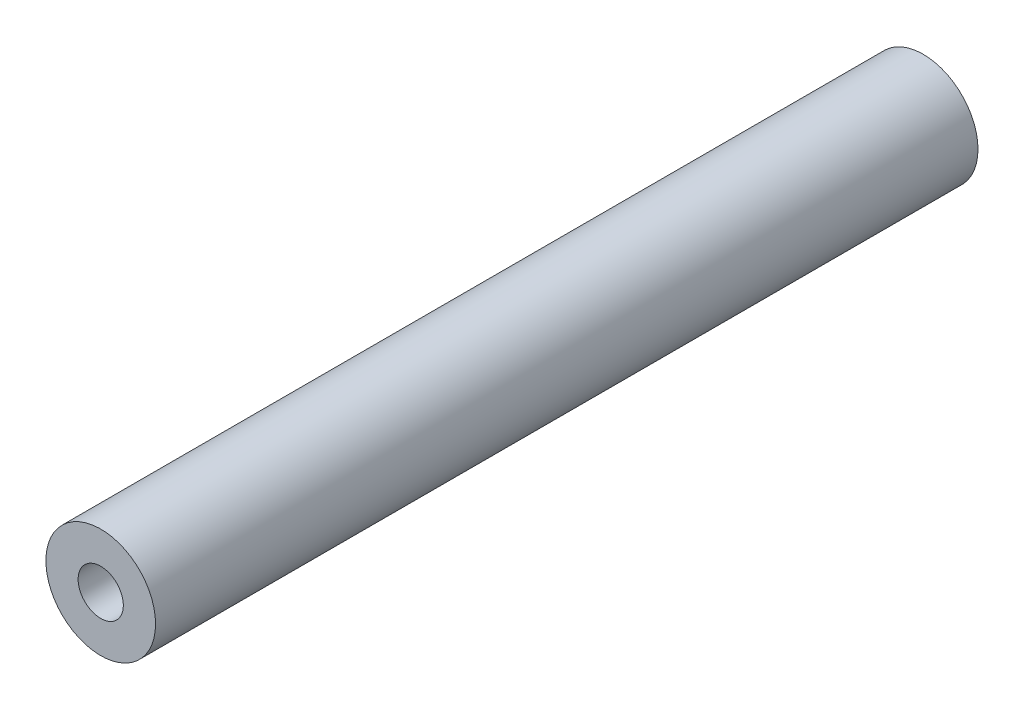
ISO-10303-21;
HEADER;
FILE_DESCRIPTION(('STEP AP214'),'2;1');
FILE_NAME('part.step','',(''),(''),'','','');
FILE_SCHEMA(('AUTOMOTIVE_DESIGN { 1 0 10303 214 1 1 1 1 }'));
ENDSEC;
DATA;
#1=APPLICATION_CONTEXT('core data for automotive mechanical design processes');
#2=APPLICATION_PROTOCOL_DEFINITION('international standard','automotive_design',2000,#1);
#3=PRODUCT_CONTEXT('',#1,'mechanical');
#4=PRODUCT('Part','Part','',(#3));
#5=PRODUCT_RELATED_PRODUCT_CATEGORY('part','',(#4));
#6=PRODUCT_DEFINITION_FORMATION('','',#4);
#7=PRODUCT_DEFINITION_CONTEXT('part definition',#1,'design');
#8=PRODUCT_DEFINITION('design','',#6,#7);
#9=PRODUCT_DEFINITION_SHAPE('','',#8);
#10=(LENGTH_UNIT() NAMED_UNIT(*) SI_UNIT(.MILLI.,.METRE.));
#11=(NAMED_UNIT(*) PLANE_ANGLE_UNIT() SI_UNIT($,.RADIAN.));
#12=(NAMED_UNIT(*) SI_UNIT($,.STERADIAN.) SOLID_ANGLE_UNIT());
#13=UNCERTAINTY_MEASURE_WITH_UNIT(LENGTH_MEASURE(1.E-05),#10,'distance_accuracy_value','');
#14=(GEOMETRIC_REPRESENTATION_CONTEXT(3) GLOBAL_UNCERTAINTY_ASSIGNED_CONTEXT((#13)) GLOBAL_UNIT_ASSIGNED_CONTEXT((#10,
#11,#12)) REPRESENTATION_CONTEXT('',''));
#15=CARTESIAN_POINT('',(0.,0.,0.));
#16=DIRECTION('',(0.,0.,1.));
#17=DIRECTION('',(1.,0.,0.));
#18=AXIS2_PLACEMENT_3D('',#15,#16,#17);
#19=CARTESIAN_POINT('',(0.,0.,60.));
#20=DIRECTION('',(0.,0.,-1.));
#21=DIRECTION('',(-1.,0.,0.));
#22=AXIS2_PLACEMENT_3D('',#19,#20,#21);
#23=CYLINDRICAL_SURFACE('',#22,4.);
#24=CARTESIAN_POINT('',(0.,0.,60.));
#25=DIRECTION('',(0.,0.,1.));
#26=DIRECTION('',(1.,0.,0.));
#27=AXIS2_PLACEMENT_3D('',#24,#25,#26);
#28=CIRCLE('',#27,4.);
#29=CARTESIAN_POINT('',(4.,0.,60.));
#30=VERTEX_POINT('',#29);
#31=EDGE_CURVE('E13',#30,#30,#28,.T.);
#32=ORIENTED_EDGE('',*,*,#31,.F.);
#33=EDGE_LOOP('',(#32));
#34=FACE_BOUND('',#33,.T.);
#35=CARTESIAN_POINT('',(0.,0.,0.));
#36=DIRECTION('',(0.,0.,1.));
#37=DIRECTION('',(1.,0.,0.));
#38=AXIS2_PLACEMENT_3D('',#35,#36,#37);
#39=CIRCLE('',#38,4.);
#40=CARTESIAN_POINT('',(4.,0.,0.));
#41=VERTEX_POINT('',#40);
#42=EDGE_CURVE('E47',#41,#41,#39,.T.);
#43=ORIENTED_EDGE('',*,*,#42,.T.);
#44=EDGE_LOOP('',(#43));
#45=FACE_BOUND('',#44,.T.);
#46=ADVANCED_FACE('F44',(#34,#45),#23,.T.);
#47=CARTESIAN_POINT('',(0.,0.,60.));
#48=DIRECTION('',(0.,0.,1.));
#49=DIRECTION('',(1.,0.,0.));
#50=AXIS2_PLACEMENT_3D('',#47,#48,#49);
#51=PLANE('',#50);
#52=CARTESIAN_POINT('',(0.,0.,60.));
#53=DIRECTION('',(0.,0.,1.));
#54=DIRECTION('',(1.,0.,0.));
#55=AXIS2_PLACEMENT_3D('',#52,#53,#54);
#56=CIRCLE('',#55,1.64999999999999);
#57=CARTESIAN_POINT('',(1.64999999999999,0.,60.));
#58=VERTEX_POINT('',#57);
#59=EDGE_CURVE('E67',#58,#58,#56,.T.);
#60=ORIENTED_EDGE('',*,*,#59,.F.);
#61=EDGE_LOOP('',(#60));
#62=FACE_BOUND('',#61,.T.);
#63=ORIENTED_EDGE('',*,*,#31,.T.);
#64=EDGE_LOOP('',(#63));
#65=FACE_BOUND('',#64,.T.);
#66=ADVANCED_FACE('F86',(#62,#65),#51,.T.);
#67=CARTESIAN_POINT('',(0.,0.,0.));
#68=DIRECTION('',(0.,0.,1.));
#69=DIRECTION('',(1.,0.,0.));
#70=AXIS2_PLACEMENT_3D('',#67,#68,#69);
#71=PLANE('',#70);
#72=CARTESIAN_POINT('',(0.,0.,0.));
#73=DIRECTION('',(0.,0.,-1.));
#74=DIRECTION('',(-1.,0.,0.));
#75=AXIS2_PLACEMENT_3D('',#72,#73,#74);
#76=CIRCLE('',#75,1.64999999999999);
#77=CARTESIAN_POINT('',(-1.64999999999999,0.,0.));
#78=VERTEX_POINT('',#77);
#79=EDGE_CURVE('E68',#78,#78,#76,.T.);
#80=ORIENTED_EDGE('',*,*,#79,.F.);
#81=EDGE_LOOP('',(#80));
#82=FACE_BOUND('',#81,.T.);
#83=ORIENTED_EDGE('',*,*,#42,.F.);
#84=EDGE_LOOP('',(#83));
#85=FACE_BOUND('',#84,.T.);
#86=ADVANCED_FACE('F83',(#82,#85),#71,.F.);
#87=CARTESIAN_POINT('',(0.,0.,50.9));
#88=DIRECTION('',(0.,0.,1.));
#89=DIRECTION('',(1.,0.,0.));
#90=AXIS2_PLACEMENT_3D('',#87,#88,#89);
#91=CONICAL_SURFACE('',#90,1.64999999999999,1.02974425867665);
#92=CARTESIAN_POINT('',(0.,0.,49.9085799786045));
#93=VERTEX_POINT('',#92);
#94=VERTEX_LOOP('',#93);
#95=FACE_BOUND('',#94,.T.);
#96=CARTESIAN_POINT('',(0.,0.,50.9));
#97=DIRECTION('',(0.,0.,1.));
#98=DIRECTION('',(1.,0.,0.));
#99=AXIS2_PLACEMENT_3D('',#96,#97,#98);
#100=CIRCLE('',#99,1.64999999999999);
#101=CARTESIAN_POINT('',(1.64999999999999,0.,50.9));
#102=VERTEX_POINT('',#101);
#103=EDGE_CURVE('E71',#102,#102,#100,.T.);
#104=ORIENTED_EDGE('',*,*,#103,.T.);
#105=EDGE_LOOP('',(#104));
#106=FACE_BOUND('',#105,.T.);
#107=ADVANCED_FACE('F85',(#95,#106),#91,.F.);
#108=CARTESIAN_POINT('',(0.,0.,60.));
#109=DIRECTION('',(0.,0.,1.));
#110=DIRECTION('',(1.,0.,0.));
#111=AXIS2_PLACEMENT_3D('',#108,#109,#110);
#112=CYLINDRICAL_SURFACE('',#111,1.64999999999999);
#113=ORIENTED_EDGE('',*,*,#103,.F.);
#114=EDGE_LOOP('',(#113));
#115=FACE_BOUND('',#114,.T.);
#116=ORIENTED_EDGE('',*,*,#59,.T.);
#117=EDGE_LOOP('',(#116));
#118=FACE_BOUND('',#117,.T.);
#119=ADVANCED_FACE('F61',(#115,#118),#112,.F.);
#120=CARTESIAN_POINT('',(0.,0.,9.1));
#121=DIRECTION('',(0.,0.,-1.));
#122=DIRECTION('',(-1.,0.,0.));
#123=AXIS2_PLACEMENT_3D('',#120,#121,#122);
#124=CONICAL_SURFACE('',#123,1.64999999999999,1.02974425867665);
#125=CARTESIAN_POINT('',(0.,0.,10.0914200213955));
#126=VERTEX_POINT('',#125);
#127=VERTEX_LOOP('',#126);
#128=FACE_BOUND('',#127,.T.);
#129=CARTESIAN_POINT('',(0.,0.,9.1));
#130=DIRECTION('',(0.,0.,-1.));
#131=DIRECTION('',(-1.,0.,0.));
#132=AXIS2_PLACEMENT_3D('',#129,#130,#131);
#133=CIRCLE('',#132,1.64999999999999);
#134=CARTESIAN_POINT('',(-1.64999999999999,0.,9.1));
#135=VERTEX_POINT('',#134);
#136=EDGE_CURVE('E65',#135,#135,#133,.T.);
#137=ORIENTED_EDGE('',*,*,#136,.T.);
#138=EDGE_LOOP('',(#137));
#139=FACE_BOUND('',#138,.T.);
#140=ADVANCED_FACE('F57',(#128,#139),#124,.F.);
#141=CARTESIAN_POINT('',(0.,0.,0.));
#142=DIRECTION('',(0.,0.,-1.));
#143=DIRECTION('',(-1.,0.,0.));
#144=AXIS2_PLACEMENT_3D('',#141,#142,#143);
#145=CYLINDRICAL_SURFACE('',#144,1.64999999999999);
#146=ORIENTED_EDGE('',*,*,#136,.F.);
#147=EDGE_LOOP('',(#146));
#148=FACE_BOUND('',#147,.T.);
#149=ORIENTED_EDGE('',*,*,#79,.T.);
#150=EDGE_LOOP('',(#149));
#151=FACE_BOUND('',#150,.T.);
#152=ADVANCED_FACE('F60',(#148,#151),#145,.F.);
#153=CLOSED_SHELL('',(#46,#66,#86,#107,#119,#140,#152));
#154=MANIFOLD_SOLID_BREP('B2',#153);
#155=ADVANCED_BREP_SHAPE_REPRESENTATION('',(#18,#154),#14);
#156=SHAPE_DEFINITION_REPRESENTATION(#9,#155);
ENDSEC;
END-ISO-10303-21;
